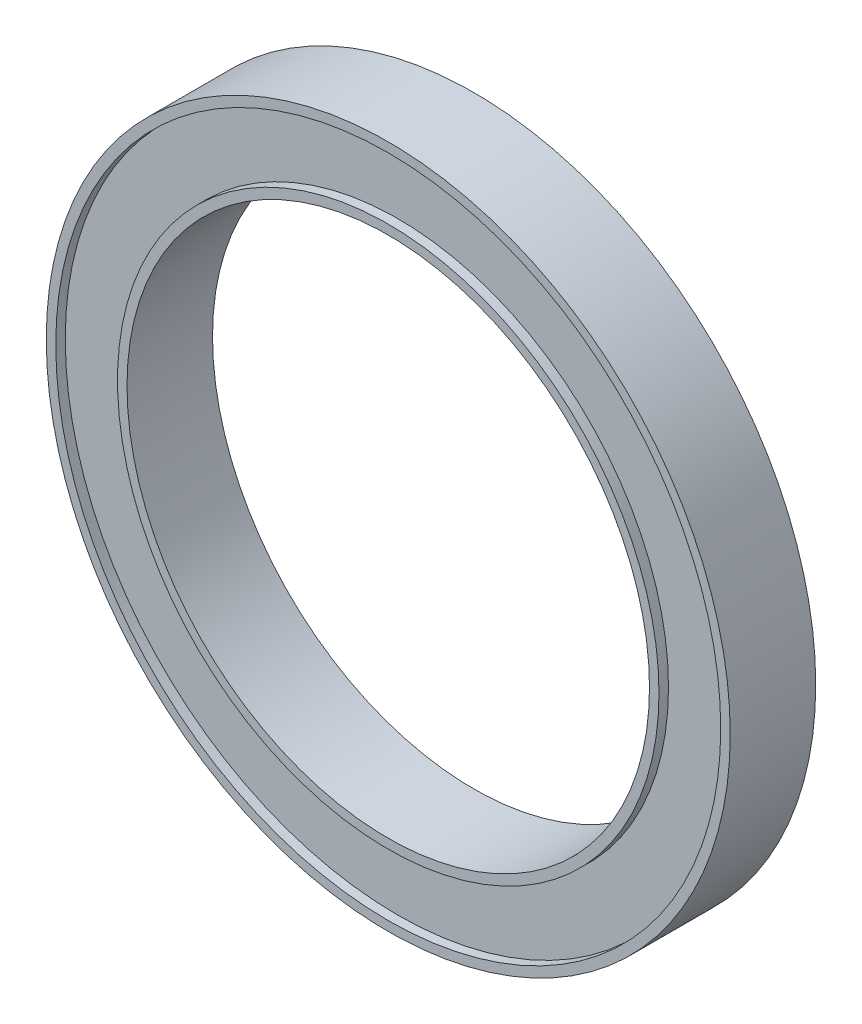
ISO-10303-21;
HEADER;
FILE_DESCRIPTION(('STEP AP214'),'2;1');
FILE_NAME('part.step','',(''),(''),'','','');
FILE_SCHEMA(('AUTOMOTIVE_DESIGN { 1 0 10303 214 1 1 1 1 }'));
ENDSEC;
DATA;
#1=APPLICATION_CONTEXT('core data for automotive mechanical design processes');
#2=APPLICATION_PROTOCOL_DEFINITION('international standard','automotive_design',2000,#1);
#3=PRODUCT_CONTEXT('',#1,'mechanical');
#4=PRODUCT('Part','Part','',(#3));
#5=PRODUCT_RELATED_PRODUCT_CATEGORY('part','',(#4));
#6=PRODUCT_DEFINITION_FORMATION('','',#4);
#7=PRODUCT_DEFINITION_CONTEXT('part definition',#1,'design');
#8=PRODUCT_DEFINITION('design','',#6,#7);
#9=PRODUCT_DEFINITION_SHAPE('','',#8);
#10=(LENGTH_UNIT() NAMED_UNIT(*) SI_UNIT(.MILLI.,.METRE.));
#11=(NAMED_UNIT(*) PLANE_ANGLE_UNIT() SI_UNIT($,.RADIAN.));
#12=(NAMED_UNIT(*) SI_UNIT($,.STERADIAN.) SOLID_ANGLE_UNIT());
#13=UNCERTAINTY_MEASURE_WITH_UNIT(LENGTH_MEASURE(1.E-05),#10,'distance_accuracy_value','');
#14=(GEOMETRIC_REPRESENTATION_CONTEXT(3) GLOBAL_UNCERTAINTY_ASSIGNED_CONTEXT((#13)) GLOBAL_UNIT_ASSIGNED_CONTEXT((#10,
#11,#12)) REPRESENTATION_CONTEXT('',''));
#15=CARTESIAN_POINT('',(0.,0.,0.));
#16=DIRECTION('',(0.,0.,1.));
#17=DIRECTION('',(1.,0.,0.));
#18=AXIS2_PLACEMENT_3D('',#15,#16,#17);
#19=CARTESIAN_POINT('',(0.,0.,0.));
#20=DIRECTION('',(0.,0.,1.));
#21=DIRECTION('',(1.,0.,0.));
#22=AXIS2_PLACEMENT_3D('',#19,#20,#21);
#23=PLANE('',#22);
#24=CARTESIAN_POINT('',(0.,0.,0.));
#25=DIRECTION('',(0.,0.,1.));
#26=DIRECTION('',(1.,0.,0.));
#27=AXIS2_PLACEMENT_3D('',#24,#25,#26);
#28=CIRCLE('',#27,27.5);
#29=CARTESIAN_POINT('',(27.5,0.,0.));
#30=VERTEX_POINT('',#29);
#31=EDGE_CURVE('E44',#30,#30,#28,.T.);
#32=ORIENTED_EDGE('',*,*,#31,.T.);
#33=EDGE_LOOP('',(#32));
#34=FACE_BOUND('',#33,.T.);
#35=CARTESIAN_POINT('',(0.,0.,0.));
#36=DIRECTION('',(0.,0.,-1.));
#37=DIRECTION('',(-1.,0.,0.));
#38=AXIS2_PLACEMENT_3D('',#35,#36,#37);
#39=CIRCLE('',#38,28.5);
#40=CARTESIAN_POINT('',(-28.5,0.,0.));
#41=VERTEX_POINT('',#40);
#42=EDGE_CURVE('E70',#41,#41,#39,.T.);
#43=ORIENTED_EDGE('',*,*,#42,.T.);
#44=EDGE_LOOP('',(#43));
#45=FACE_BOUND('',#44,.T.);
#46=ADVANCED_FACE('F33',(#34,#45),#23,.F.);
#47=CARTESIAN_POINT('',(0.,0.,9.));
#48=DIRECTION('',(0.,0.,1.));
#49=DIRECTION('',(1.,0.,0.));
#50=AXIS2_PLACEMENT_3D('',#47,#48,#49);
#51=PLANE('',#50);
#52=CARTESIAN_POINT('',(0.,0.,9.));
#53=DIRECTION('',(0.,0.,1.));
#54=DIRECTION('',(1.,0.,0.));
#55=AXIS2_PLACEMENT_3D('',#52,#53,#54);
#56=CIRCLE('',#55,27.5);
#57=CARTESIAN_POINT('',(27.5,0.,9.));
#58=VERTEX_POINT('',#57);
#59=EDGE_CURVE('E46',#58,#58,#56,.T.);
#60=ORIENTED_EDGE('',*,*,#59,.F.);
#61=EDGE_LOOP('',(#60));
#62=FACE_BOUND('',#61,.T.);
#63=CARTESIAN_POINT('',(0.,0.,9.));
#64=DIRECTION('',(0.,0.,1.));
#65=DIRECTION('',(1.,0.,0.));
#66=AXIS2_PLACEMENT_3D('',#63,#64,#65);
#67=CIRCLE('',#66,28.5);
#68=CARTESIAN_POINT('',(28.5,0.,9.));
#69=VERTEX_POINT('',#68);
#70=EDGE_CURVE('E58',#69,#69,#67,.T.);
#71=ORIENTED_EDGE('',*,*,#70,.T.);
#72=EDGE_LOOP('',(#71));
#73=FACE_BOUND('',#72,.T.);
#74=ADVANCED_FACE('F100',(#62,#73),#51,.T.);
#75=CARTESIAN_POINT('',(0.,0.,9.));
#76=DIRECTION('',(0.,0.,-1.));
#77=DIRECTION('',(-1.,0.,0.));
#78=AXIS2_PLACEMENT_3D('',#75,#76,#77);
#79=CYLINDRICAL_SURFACE('',#78,36.);
#80=CARTESIAN_POINT('',(0.,0.,9.));
#81=DIRECTION('',(0.,0.,1.));
#82=DIRECTION('',(1.,0.,0.));
#83=AXIS2_PLACEMENT_3D('',#80,#81,#82);
#84=CIRCLE('',#83,36.);
#85=CARTESIAN_POINT('',(36.,0.,9.));
#86=VERTEX_POINT('',#85);
#87=EDGE_CURVE('E10',#86,#86,#84,.T.);
#88=ORIENTED_EDGE('',*,*,#87,.F.);
#89=EDGE_LOOP('',(#88));
#90=FACE_BOUND('',#89,.T.);
#91=CARTESIAN_POINT('',(0.,0.,0.));
#92=DIRECTION('',(0.,0.,1.));
#93=DIRECTION('',(1.,0.,0.));
#94=AXIS2_PLACEMENT_3D('',#91,#92,#93);
#95=CIRCLE('',#94,36.);
#96=CARTESIAN_POINT('',(36.,0.,0.));
#97=VERTEX_POINT('',#96);
#98=EDGE_CURVE('E37',#97,#97,#95,.T.);
#99=ORIENTED_EDGE('',*,*,#98,.T.);
#100=EDGE_LOOP('',(#99));
#101=FACE_BOUND('',#100,.T.);
#102=ADVANCED_FACE('F35',(#90,#101),#79,.T.);
#103=CARTESIAN_POINT('',(0.,0.,9.));
#104=DIRECTION('',(0.,0.,1.));
#105=DIRECTION('',(1.,0.,0.));
#106=AXIS2_PLACEMENT_3D('',#103,#104,#105);
#107=CIRCLE('',#106,35.);
#108=CARTESIAN_POINT('',(35.,0.,9.));
#109=VERTEX_POINT('',#108);
#110=EDGE_CURVE('E52',#109,#109,#107,.T.);
#111=ORIENTED_EDGE('',*,*,#110,.F.);
#112=EDGE_LOOP('',(#111));
#113=FACE_BOUND('',#112,.T.);
#114=ORIENTED_EDGE('',*,*,#87,.T.);
#115=EDGE_LOOP('',(#114));
#116=FACE_BOUND('',#115,.T.);
#117=ADVANCED_FACE('F96',(#113,#116),#51,.T.);
#118=CARTESIAN_POINT('',(0.,0.,0.));
#119=DIRECTION('',(0.,0.,-1.));
#120=DIRECTION('',(-1.,0.,0.));
#121=AXIS2_PLACEMENT_3D('',#118,#119,#120);
#122=CIRCLE('',#121,35.);
#123=CARTESIAN_POINT('',(-35.,0.,0.));
#124=VERTEX_POINT('',#123);
#125=EDGE_CURVE('E64',#124,#124,#122,.T.);
#126=ORIENTED_EDGE('',*,*,#125,.F.);
#127=EDGE_LOOP('',(#126));
#128=FACE_BOUND('',#127,.T.);
#129=ORIENTED_EDGE('',*,*,#98,.F.);
#130=EDGE_LOOP('',(#129));
#131=FACE_BOUND('',#130,.T.);
#132=ADVANCED_FACE('F92',(#128,#131),#23,.F.);
#133=CARTESIAN_POINT('',(0.,0.,0.));
#134=DIRECTION('',(0.,0.,1.));
#135=DIRECTION('',(1.,0.,0.));
#136=AXIS2_PLACEMENT_3D('',#133,#134,#135);
#137=CYLINDRICAL_SURFACE('',#136,27.5);
#138=ORIENTED_EDGE('',*,*,#31,.F.);
#139=EDGE_LOOP('',(#138));
#140=FACE_BOUND('',#139,.T.);
#141=ORIENTED_EDGE('',*,*,#59,.T.);
#142=EDGE_LOOP('',(#141));
#143=FACE_BOUND('',#142,.T.);
#144=ADVANCED_FACE('F95',(#140,#143),#137,.F.);
#145=CARTESIAN_POINT('',(0.,0.,8.));
#146=DIRECTION('',(0.,0.,1.));
#147=DIRECTION('',(1.,0.,0.));
#148=AXIS2_PLACEMENT_3D('',#145,#146,#147);
#149=CYLINDRICAL_SURFACE('',#148,35.);
#150=CARTESIAN_POINT('',(0.,0.,8.));
#151=DIRECTION('',(0.,0.,1.));
#152=DIRECTION('',(1.,0.,0.));
#153=AXIS2_PLACEMENT_3D('',#150,#151,#152);
#154=CIRCLE('',#153,35.);
#155=CARTESIAN_POINT('',(35.,0.,8.));
#156=VERTEX_POINT('',#155);
#157=EDGE_CURVE('E49',#156,#156,#154,.T.);
#158=ORIENTED_EDGE('',*,*,#157,.F.);
#159=EDGE_LOOP('',(#158));
#160=FACE_BOUND('',#159,.T.);
#161=ORIENTED_EDGE('',*,*,#110,.T.);
#162=EDGE_LOOP('',(#161));
#163=FACE_BOUND('',#162,.T.);
#164=ADVANCED_FACE('F117',(#160,#163),#149,.F.);
#165=CARTESIAN_POINT('',(0.,0.,8.));
#166=DIRECTION('',(0.,0.,1.));
#167=DIRECTION('',(1.,0.,0.));
#168=AXIS2_PLACEMENT_3D('',#165,#166,#167);
#169=PLANE('',#168);
#170=CARTESIAN_POINT('',(0.,0.,8.));
#171=DIRECTION('',(0.,0.,1.));
#172=DIRECTION('',(1.,0.,0.));
#173=AXIS2_PLACEMENT_3D('',#170,#171,#172);
#174=CIRCLE('',#173,28.5);
#175=CARTESIAN_POINT('',(28.5,0.,8.));
#176=VERTEX_POINT('',#175);
#177=EDGE_CURVE('E55',#176,#176,#174,.T.);
#178=ORIENTED_EDGE('',*,*,#177,.F.);
#179=EDGE_LOOP('',(#178));
#180=FACE_BOUND('',#179,.T.);
#181=ORIENTED_EDGE('',*,*,#157,.T.);
#182=EDGE_LOOP('',(#181));
#183=FACE_BOUND('',#182,.T.);
#184=ADVANCED_FACE('F121',(#180,#183),#169,.T.);
#185=CARTESIAN_POINT('',(0.,0.,8.));
#186=DIRECTION('',(0.,0.,1.));
#187=DIRECTION('',(1.,0.,0.));
#188=AXIS2_PLACEMENT_3D('',#185,#186,#187);
#189=CYLINDRICAL_SURFACE('',#188,28.5);
#190=ORIENTED_EDGE('',*,*,#177,.T.);
#191=EDGE_LOOP('',(#190));
#192=FACE_BOUND('',#191,.T.);
#193=ORIENTED_EDGE('',*,*,#70,.F.);
#194=EDGE_LOOP('',(#193));
#195=FACE_BOUND('',#194,.T.);
#196=ADVANCED_FACE('F88',(#192,#195),#189,.T.);
#197=CARTESIAN_POINT('',(0.,0.,1.));
#198=DIRECTION('',(0.,0.,-1.));
#199=DIRECTION('',(-1.,0.,0.));
#200=AXIS2_PLACEMENT_3D('',#197,#198,#199);
#201=CYLINDRICAL_SURFACE('',#200,35.);
#202=CARTESIAN_POINT('',(0.,0.,1.));
#203=DIRECTION('',(0.,0.,-1.));
#204=DIRECTION('',(-1.,0.,0.));
#205=AXIS2_PLACEMENT_3D('',#202,#203,#204);
#206=CIRCLE('',#205,35.);
#207=CARTESIAN_POINT('',(-35.,0.,1.));
#208=VERTEX_POINT('',#207);
#209=EDGE_CURVE('E61',#208,#208,#206,.T.);
#210=ORIENTED_EDGE('',*,*,#209,.F.);
#211=EDGE_LOOP('',(#210));
#212=FACE_BOUND('',#211,.T.);
#213=ORIENTED_EDGE('',*,*,#125,.T.);
#214=EDGE_LOOP('',(#213));
#215=FACE_BOUND('',#214,.T.);
#216=ADVANCED_FACE('F82',(#212,#215),#201,.F.);
#217=CARTESIAN_POINT('',(0.,0.,1.));
#218=DIRECTION('',(0.,0.,-1.));
#219=DIRECTION('',(-1.,0.,0.));
#220=AXIS2_PLACEMENT_3D('',#217,#218,#219);
#221=PLANE('',#220);
#222=CARTESIAN_POINT('',(0.,0.,1.));
#223=DIRECTION('',(0.,0.,-1.));
#224=DIRECTION('',(-1.,0.,0.));
#225=AXIS2_PLACEMENT_3D('',#222,#223,#224);
#226=CIRCLE('',#225,28.5);
#227=CARTESIAN_POINT('',(-28.5,0.,1.));
#228=VERTEX_POINT('',#227);
#229=EDGE_CURVE('E67',#228,#228,#226,.T.);
#230=ORIENTED_EDGE('',*,*,#229,.F.);
#231=EDGE_LOOP('',(#230));
#232=FACE_BOUND('',#231,.T.);
#233=ORIENTED_EDGE('',*,*,#209,.T.);
#234=EDGE_LOOP('',(#233));
#235=FACE_BOUND('',#234,.T.);
#236=ADVANCED_FACE('F79',(#232,#235),#221,.T.);
#237=CARTESIAN_POINT('',(0.,0.,1.));
#238=DIRECTION('',(0.,0.,-1.));
#239=DIRECTION('',(-1.,0.,0.));
#240=AXIS2_PLACEMENT_3D('',#237,#238,#239);
#241=CYLINDRICAL_SURFACE('',#240,28.5);
#242=ORIENTED_EDGE('',*,*,#229,.T.);
#243=EDGE_LOOP('',(#242));
#244=FACE_BOUND('',#243,.T.);
#245=ORIENTED_EDGE('',*,*,#42,.F.);
#246=EDGE_LOOP('',(#245));
#247=FACE_BOUND('',#246,.T.);
#248=ADVANCED_FACE('F76',(#244,#247),#241,.T.);
#249=CLOSED_SHELL('',(#46,#74,#102,#117,#132,#144,#164,#184,#196,#216,#236,#248));
#250=MANIFOLD_SOLID_BREP('B2',#249);
#251=ADVANCED_BREP_SHAPE_REPRESENTATION('',(#18,#250),#14);
#252=SHAPE_DEFINITION_REPRESENTATION(#9,#251);
ENDSEC;
END-ISO-10303-21;
